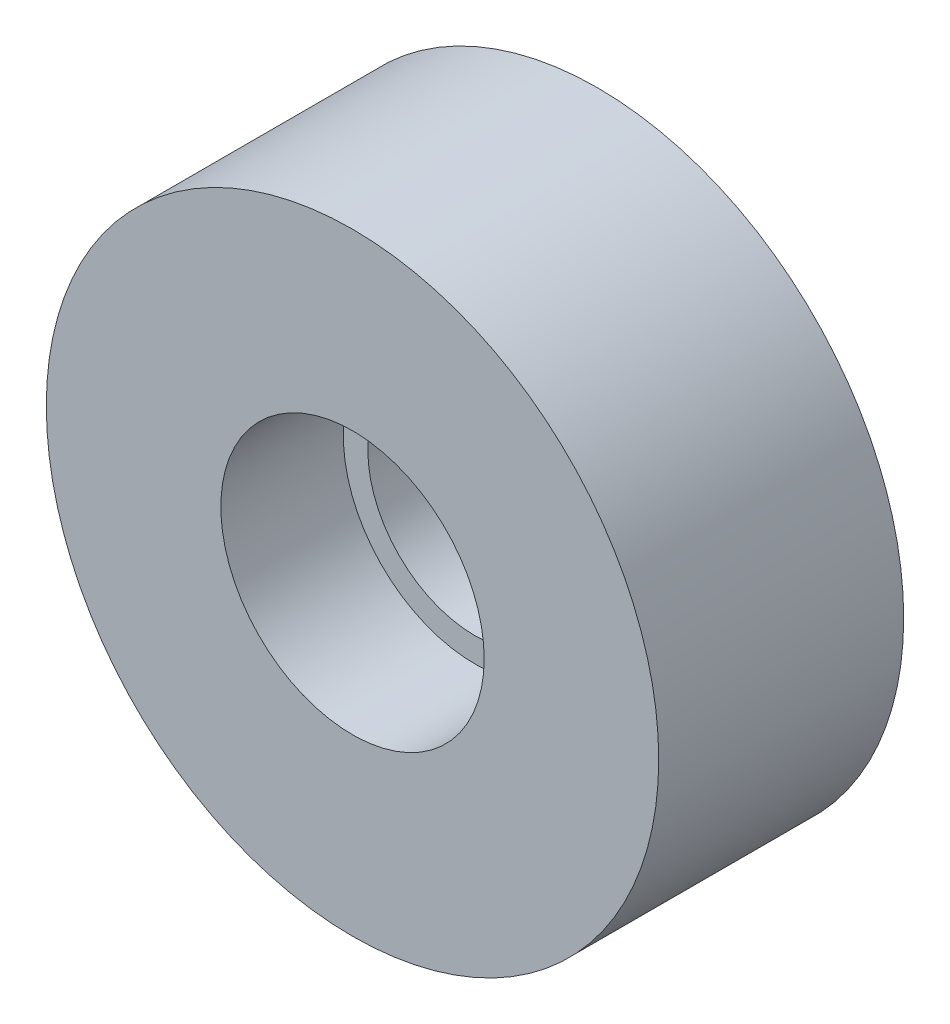
ISO-10303-21;
HEADER;
FILE_DESCRIPTION(('STEP AP214'),'2;1');
FILE_NAME('part.step','',(''),(''),'','','');
FILE_SCHEMA(('AUTOMOTIVE_DESIGN { 1 0 10303 214 1 1 1 1 }'));
ENDSEC;
DATA;
#1=APPLICATION_CONTEXT('core data for automotive mechanical design processes');
#2=APPLICATION_PROTOCOL_DEFINITION('international standard','automotive_design',2000,#1);
#3=PRODUCT_CONTEXT('',#1,'mechanical');
#4=PRODUCT('Part','Part','',(#3));
#5=PRODUCT_RELATED_PRODUCT_CATEGORY('part','',(#4));
#6=PRODUCT_DEFINITION_FORMATION('','',#4);
#7=PRODUCT_DEFINITION_CONTEXT('part definition',#1,'design');
#8=PRODUCT_DEFINITION('design','',#6,#7);
#9=PRODUCT_DEFINITION_SHAPE('','',#8);
#10=(LENGTH_UNIT() NAMED_UNIT(*) SI_UNIT(.MILLI.,.METRE.));
#11=(NAMED_UNIT(*) PLANE_ANGLE_UNIT() SI_UNIT($,.RADIAN.));
#12=(NAMED_UNIT(*) SI_UNIT($,.STERADIAN.) SOLID_ANGLE_UNIT());
#13=UNCERTAINTY_MEASURE_WITH_UNIT(LENGTH_MEASURE(1.E-05),#10,'distance_accuracy_value','');
#14=(GEOMETRIC_REPRESENTATION_CONTEXT(3) GLOBAL_UNCERTAINTY_ASSIGNED_CONTEXT((#13)) GLOBAL_UNIT_ASSIGNED_CONTEXT((#10,
#11,#12)) REPRESENTATION_CONTEXT('',''));
#15=CARTESIAN_POINT('',(0.,0.,0.));
#16=DIRECTION('',(0.,0.,1.));
#17=DIRECTION('',(1.,0.,0.));
#18=AXIS2_PLACEMENT_3D('',#15,#16,#17);
#19=CARTESIAN_POINT('',(0.,0.,4.));
#20=DIRECTION('',(0.,0.,-1.));
#21=DIRECTION('',(-1.,0.,0.));
#22=AXIS2_PLACEMENT_3D('',#19,#20,#21);
#23=CYLINDRICAL_SURFACE('',#22,5.);
#24=CARTESIAN_POINT('',(0.,0.,4.));
#25=DIRECTION('',(0.,0.,1.));
#26=DIRECTION('',(1.,0.,0.));
#27=AXIS2_PLACEMENT_3D('',#24,#25,#26);
#28=CIRCLE('',#27,5.);
#29=CARTESIAN_POINT('',(5.,0.,4.));
#30=VERTEX_POINT('',#29);
#31=EDGE_CURVE('E10',#30,#30,#28,.T.);
#32=ORIENTED_EDGE('',*,*,#31,.F.);
#33=EDGE_LOOP('',(#32));
#34=FACE_BOUND('',#33,.T.);
#35=CARTESIAN_POINT('',(0.,0.,0.));
#36=DIRECTION('',(0.,0.,1.));
#37=DIRECTION('',(1.,0.,0.));
#38=AXIS2_PLACEMENT_3D('',#35,#36,#37);
#39=CIRCLE('',#38,5.);
#40=CARTESIAN_POINT('',(5.,0.,0.));
#41=VERTEX_POINT('',#40);
#42=EDGE_CURVE('E38',#41,#41,#39,.T.);
#43=ORIENTED_EDGE('',*,*,#42,.T.);
#44=EDGE_LOOP('',(#43));
#45=FACE_BOUND('',#44,.T.);
#46=ADVANCED_FACE('F31',(#34,#45),#23,.T.);
#47=CARTESIAN_POINT('',(0.,0.,4.));
#48=DIRECTION('',(0.,0.,1.));
#49=DIRECTION('',(1.,0.,0.));
#50=AXIS2_PLACEMENT_3D('',#47,#48,#49);
#51=PLANE('',#50);
#52=CARTESIAN_POINT('',(0.,0.,4.));
#53=DIRECTION('',(0.,0.,1.));
#54=DIRECTION('',(1.,0.,0.));
#55=AXIS2_PLACEMENT_3D('',#52,#53,#54);
#56=CIRCLE('',#55,2.15);
#57=CARTESIAN_POINT('',(2.15,0.,4.));
#58=VERTEX_POINT('',#57);
#59=EDGE_CURVE('E45',#58,#58,#56,.T.);
#60=ORIENTED_EDGE('',*,*,#59,.F.);
#61=EDGE_LOOP('',(#60));
#62=FACE_BOUND('',#61,.T.);
#63=ORIENTED_EDGE('',*,*,#31,.T.);
#64=EDGE_LOOP('',(#63));
#65=FACE_BOUND('',#64,.T.);
#66=ADVANCED_FACE('F72',(#62,#65),#51,.T.);
#67=CARTESIAN_POINT('',(0.,0.,0.));
#68=DIRECTION('',(0.,0.,1.));
#69=DIRECTION('',(1.,0.,0.));
#70=AXIS2_PLACEMENT_3D('',#67,#68,#69);
#71=PLANE('',#70);
#72=CARTESIAN_POINT('',(0.,0.,0.));
#73=DIRECTION('',(0.,0.,-1.));
#74=DIRECTION('',(-1.,0.,0.));
#75=AXIS2_PLACEMENT_3D('',#72,#73,#74);
#76=CIRCLE('',#75,1.75);
#77=CARTESIAN_POINT('',(-1.75,0.,0.));
#78=VERTEX_POINT('',#77);
#79=EDGE_CURVE('E50',#78,#78,#76,.T.);
#80=ORIENTED_EDGE('',*,*,#79,.F.);
#81=EDGE_LOOP('',(#80));
#82=FACE_BOUND('',#81,.T.);
#83=ORIENTED_EDGE('',*,*,#42,.F.);
#84=EDGE_LOOP('',(#83));
#85=FACE_BOUND('',#84,.T.);
#86=ADVANCED_FACE('F68',(#82,#85),#71,.F.);
#87=CARTESIAN_POINT('',(0.,0.,2.));
#88=DIRECTION('',(0.,0.,1.));
#89=DIRECTION('',(1.,0.,0.));
#90=AXIS2_PLACEMENT_3D('',#87,#88,#89);
#91=CYLINDRICAL_SURFACE('',#90,2.15);
#92=CARTESIAN_POINT('',(0.,0.,2.));
#93=DIRECTION('',(0.,0.,1.));
#94=DIRECTION('',(1.,0.,0.));
#95=AXIS2_PLACEMENT_3D('',#92,#93,#94);
#96=CIRCLE('',#95,2.15);
#97=CARTESIAN_POINT('',(2.15,0.,2.));
#98=VERTEX_POINT('',#97);
#99=EDGE_CURVE('E43',#98,#98,#96,.T.);
#100=ORIENTED_EDGE('',*,*,#99,.F.);
#101=EDGE_LOOP('',(#100));
#102=FACE_BOUND('',#101,.T.);
#103=ORIENTED_EDGE('',*,*,#59,.T.);
#104=EDGE_LOOP('',(#103));
#105=FACE_BOUND('',#104,.T.);
#106=ADVANCED_FACE('F62',(#102,#105),#91,.F.);
#107=CARTESIAN_POINT('',(0.,0.,2.));
#108=DIRECTION('',(0.,0.,1.));
#109=DIRECTION('',(1.,0.,0.));
#110=AXIS2_PLACEMENT_3D('',#107,#108,#109);
#111=PLANE('',#110);
#112=CARTESIAN_POINT('',(0.,0.,2.));
#113=DIRECTION('',(0.,0.,1.));
#114=DIRECTION('',(1.,0.,0.));
#115=AXIS2_PLACEMENT_3D('',#112,#113,#114);
#116=CIRCLE('',#115,1.75);
#117=CARTESIAN_POINT('',(1.75,0.,2.));
#118=VERTEX_POINT('',#117);
#119=EDGE_CURVE('E34',#118,#118,#116,.T.);
#120=ORIENTED_EDGE('',*,*,#119,.F.);
#121=EDGE_LOOP('',(#120));
#122=FACE_BOUND('',#121,.T.);
#123=ORIENTED_EDGE('',*,*,#99,.T.);
#124=EDGE_LOOP('',(#123));
#125=FACE_BOUND('',#124,.T.);
#126=ADVANCED_FACE('F59',(#122,#125),#111,.T.);
#127=CARTESIAN_POINT('',(0.,0.,4.));
#128=DIRECTION('',(0.,0.,-1.));
#129=DIRECTION('',(-1.,0.,0.));
#130=AXIS2_PLACEMENT_3D('',#127,#128,#129);
#131=CYLINDRICAL_SURFACE('',#130,1.75);
#132=ORIENTED_EDGE('',*,*,#119,.T.);
#133=EDGE_LOOP('',(#132));
#134=FACE_BOUND('',#133,.T.);
#135=ORIENTED_EDGE('',*,*,#79,.T.);
#136=EDGE_LOOP('',(#135));
#137=FACE_BOUND('',#136,.T.);
#138=ADVANCED_FACE('F57',(#134,#137),#131,.F.);
#139=CLOSED_SHELL('',(#46,#66,#86,#106,#126,#138));
#140=MANIFOLD_SOLID_BREP('B2',#139);
#141=ADVANCED_BREP_SHAPE_REPRESENTATION('',(#18,#140),#14);
#142=SHAPE_DEFINITION_REPRESENTATION(#9,#141);
ENDSEC;
END-ISO-10303-21;
